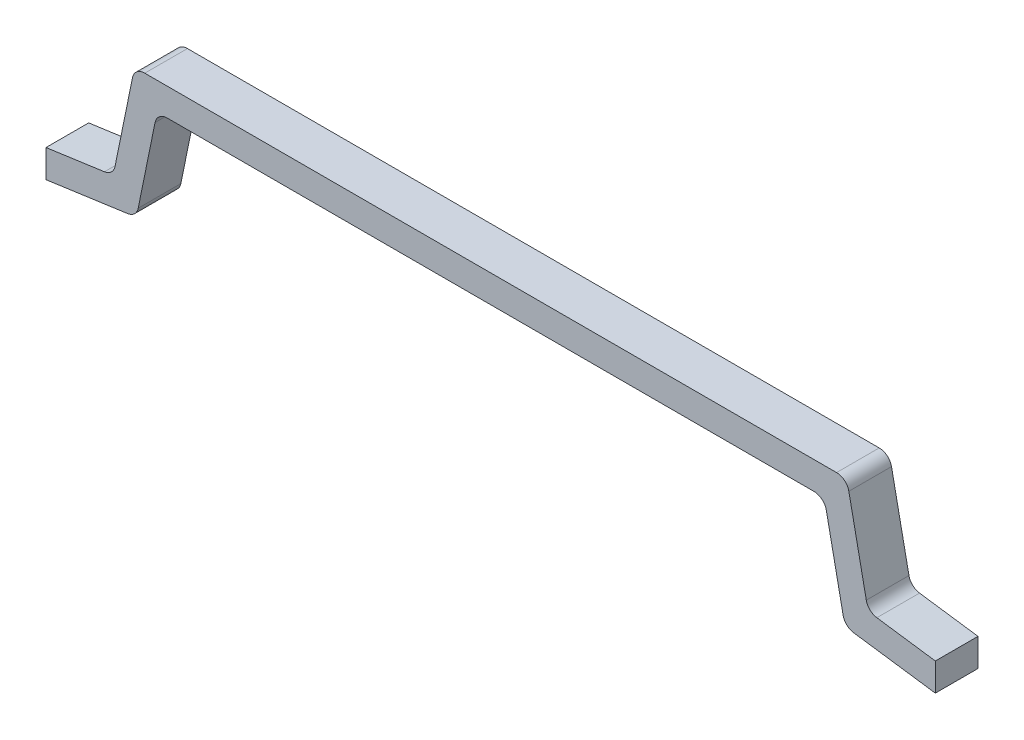
ISO-10303-21;
HEADER;
FILE_DESCRIPTION(('STEP AP214'),'2;1');
FILE_NAME('part.step','',(''),(''),'','','');
FILE_SCHEMA(('AUTOMOTIVE_DESIGN { 1 0 10303 214 1 1 1 1 }'));
ENDSEC;
DATA;
#1=APPLICATION_CONTEXT('core data for automotive mechanical design processes');
#2=APPLICATION_PROTOCOL_DEFINITION('international standard','automotive_design',2000,#1);
#3=PRODUCT_CONTEXT('',#1,'mechanical');
#4=PRODUCT('Part','Part','',(#3));
#5=PRODUCT_RELATED_PRODUCT_CATEGORY('part','',(#4));
#6=PRODUCT_DEFINITION_FORMATION('','',#4);
#7=PRODUCT_DEFINITION_CONTEXT('part definition',#1,'design');
#8=PRODUCT_DEFINITION('design','',#6,#7);
#9=PRODUCT_DEFINITION_SHAPE('','',#8);
#10=(LENGTH_UNIT() NAMED_UNIT(*) SI_UNIT(.MILLI.,.METRE.));
#11=(NAMED_UNIT(*) PLANE_ANGLE_UNIT() SI_UNIT($,.RADIAN.));
#12=(NAMED_UNIT(*) SI_UNIT($,.STERADIAN.) SOLID_ANGLE_UNIT());
#13=UNCERTAINTY_MEASURE_WITH_UNIT(LENGTH_MEASURE(1.E-05),#10,'distance_accuracy_value','');
#14=(GEOMETRIC_REPRESENTATION_CONTEXT(3) GLOBAL_UNCERTAINTY_ASSIGNED_CONTEXT((#13)) GLOBAL_UNIT_ASSIGNED_CONTEXT((#10,
#11,#12)) REPRESENTATION_CONTEXT('',''));
#15=CARTESIAN_POINT('',(0.,0.,0.));
#16=DIRECTION('',(0.,0.,1.));
#17=DIRECTION('',(1.,0.,0.));
#18=AXIS2_PLACEMENT_3D('',#15,#16,#17);
#19=CARTESIAN_POINT('',(1.01826531005711,-0.207636815585533,0.51));
#20=DIRECTION('',(-0.979836553914043,0.199800719753091,0.));
#21=DIRECTION('',(-0.199800719753091,-0.979836553914043,0.));
#22=AXIS2_PLACEMENT_3D('',#19,#20,#21);
#23=PLANE('',#22);
#24=DIRECTION('',(0.199800719753091,0.979836553914043,0.));
#25=VECTOR('',#24,1.);
#26=CARTESIAN_POINT('',(1.01826531005711,-0.207636815585533,0.));
#27=LINE('',#26,#25);
#28=CARTESIAN_POINT('',(1.10191926281016,0.202607956746275,0.));
#29=VERTEX_POINT('',#28);
#30=CARTESIAN_POINT('',(1.30325454437525,1.18997010796296,0.));
#31=VERTEX_POINT('',#30);
#32=EDGE_CURVE('E257',#29,#31,#27,.T.);
#33=ORIENTED_EDGE('',*,*,#32,.T.);
#34=DIRECTION('',(0.,0.,-1.));
#35=VECTOR('',#34,1.);
#36=CARTESIAN_POINT('',(1.30325454437525,1.18997010796296,0.51));
#37=LINE('',#36,#35);
#38=CARTESIAN_POINT('',(1.30325454437525,1.18997010796296,0.51));
#39=VERTEX_POINT('',#38);
#40=EDGE_CURVE('E318',#31,#39,#37,.F.);
#41=ORIENTED_EDGE('',*,*,#40,.T.);
#42=DIRECTION('',(0.199800719753091,0.979836553914043,0.));
#43=VECTOR('',#42,1.);
#44=CARTESIAN_POINT('',(1.01826531005711,-0.207636815585533,0.51));
#45=LINE('',#44,#43);
#46=CARTESIAN_POINT('',(1.10191926281016,0.202607956746275,0.51));
#47=VERTEX_POINT('',#46);
#48=EDGE_CURVE('E258',#47,#39,#45,.T.);
#49=ORIENTED_EDGE('',*,*,#48,.F.);
#50=DIRECTION('',(0.,0.,-1.));
#51=VECTOR('',#50,1.);
#52=CARTESIAN_POINT('',(1.10191926281016,0.202607956746275,0.));
#53=LINE('',#52,#51);
#54=EDGE_CURVE('E315',#47,#29,#53,.T.);
#55=ORIENTED_EDGE('',*,*,#54,.T.);
#56=EDGE_LOOP('',(#33,#41,#49,#55));
#57=FACE_BOUND('',#56,.T.);
#58=ADVANCED_FACE('F35',(#57),#23,.F.);
#59=CARTESIAN_POINT('',(0.,1.31,0.51));
#60=DIRECTION('',(0.,1.,0.));
#61=DIRECTION('',(-1.,0.,0.));
#62=AXIS2_PLACEMENT_3D('',#59,#60,#61);
#63=PLANE('',#62);
#64=DIRECTION('',(1.,0.,0.));
#65=VECTOR('',#64,1.);
#66=CARTESIAN_POINT('',(0.,1.31,0.51));
#67=LINE('',#66,#65);
#68=CARTESIAN_POINT('',(1.45023002746236,1.31,0.51));
#69=VERTEX_POINT('',#68);
#70=CARTESIAN_POINT('',(9.17976997253764,1.31,0.51));
#71=VERTEX_POINT('',#70);
#72=EDGE_CURVE('E261',#69,#71,#67,.T.);
#73=ORIENTED_EDGE('',*,*,#72,.F.);
#74=DIRECTION('',(0.,0.,-1.));
#75=VECTOR('',#74,1.);
#76=CARTESIAN_POINT('',(1.45023002746236,1.31,0.));
#77=LINE('',#76,#75);
#78=CARTESIAN_POINT('',(1.45023002746236,1.31,0.));
#79=VERTEX_POINT('',#78);
#80=EDGE_CURVE('E312',#69,#79,#77,.T.);
#81=ORIENTED_EDGE('',*,*,#80,.T.);
#82=DIRECTION('',(1.,0.,0.));
#83=VECTOR('',#82,1.);
#84=CARTESIAN_POINT('',(0.,1.31,0.));
#85=LINE('',#84,#83);
#86=CARTESIAN_POINT('',(9.17976997253764,1.31,0.));
#87=VERTEX_POINT('',#86);
#88=EDGE_CURVE('E279',#79,#87,#85,.T.);
#89=ORIENTED_EDGE('',*,*,#88,.T.);
#90=DIRECTION('',(0.,0.,-1.));
#91=VECTOR('',#90,1.);
#92=CARTESIAN_POINT('',(9.17976997253764,1.31,0.));
#93=LINE('',#92,#91);
#94=EDGE_CURVE('E235',#71,#87,#93,.T.);
#95=ORIENTED_EDGE('',*,*,#94,.F.);
#96=EDGE_LOOP('',(#73,#81,#89,#95));
#97=FACE_BOUND('',#96,.T.);
#98=ADVANCED_FACE('F361',(#97),#63,.F.);
#99=CARTESIAN_POINT('',(0.,1.64,0.51));
#100=DIRECTION('',(0.,1.,0.));
#101=DIRECTION('',(0.,0.,1.));
#102=AXIS2_PLACEMENT_3D('',#99,#100,#101);
#103=PLANE('',#102);
#104=DIRECTION('',(1.,0.,0.));
#105=VECTOR('',#104,1.);
#106=CARTESIAN_POINT('',(0.,1.64,0.));
#107=LINE('',#106,#105);
#108=CARTESIAN_POINT('',(1.18073022014588,1.64,0.));
#109=VERTEX_POINT('',#108);
#110=CARTESIAN_POINT('',(9.44926977985412,1.64,0.));
#111=VERTEX_POINT('',#110);
#112=EDGE_CURVE('E281',#109,#111,#107,.T.);
#113=ORIENTED_EDGE('',*,*,#112,.F.);
#114=DIRECTION('',(0.,0.,-1.));
#115=VECTOR('',#114,1.);
#116=CARTESIAN_POINT('',(1.18073022014588,1.64,0.51));
#117=LINE('',#116,#115);
#118=CARTESIAN_POINT('',(1.18073022014588,1.64,0.51));
#119=VERTEX_POINT('',#118);
#120=EDGE_CURVE('E306',#109,#119,#117,.F.);
#121=ORIENTED_EDGE('',*,*,#120,.T.);
#122=DIRECTION('',(1.,0.,0.));
#123=VECTOR('',#122,1.);
#124=CARTESIAN_POINT('',(0.,1.64,0.51));
#125=LINE('',#124,#123);
#126=CARTESIAN_POINT('',(9.44926977985412,1.64,0.51));
#127=VERTEX_POINT('',#126);
#128=EDGE_CURVE('E264',#119,#127,#125,.T.);
#129=ORIENTED_EDGE('',*,*,#128,.T.);
#130=DIRECTION('',(0.,0.,-1.));
#131=VECTOR('',#130,1.);
#132=CARTESIAN_POINT('',(9.44926977985412,1.64,0.51));
#133=LINE('',#132,#131);
#134=EDGE_CURVE('E228',#111,#127,#133,.F.);
#135=ORIENTED_EDGE('',*,*,#134,.F.);
#136=EDGE_LOOP('',(#113,#121,#129,#135));
#137=FACE_BOUND('',#136,.T.);
#138=ADVANCED_FACE('F393',(#137),#103,.T.);
#139=CARTESIAN_POINT('',(0.694919247265474,-0.141702578067013,0.51));
#140=DIRECTION('',(-0.979836553914043,0.199800719753091,0.));
#141=DIRECTION('',(-0.199800719753091,-0.979836553914043,0.));
#142=AXIS2_PLACEMENT_3D('',#139,#140,#141);
#143=PLANE('',#142);
#144=DIRECTION('',(0.199800719753091,0.979836553914043,0.));
#145=VECTOR('',#144,1.);
#146=CARTESIAN_POINT('',(0.694919247265474,-0.141702578067013,0.51));
#147=LINE('',#146,#145);
#148=CARTESIAN_POINT('',(0.82514908228355,0.496953543485479,0.51));
#149=VERTEX_POINT('',#148);
#150=CARTESIAN_POINT('',(1.03375473705877,1.51997010796296,0.51));
#151=VERTEX_POINT('',#150);
#152=EDGE_CURVE('E266',#149,#151,#147,.T.);
#153=ORIENTED_EDGE('',*,*,#152,.T.);
#154=DIRECTION('',(0.,0.,-1.));
#155=VECTOR('',#154,1.);
#156=CARTESIAN_POINT('',(1.03375473705877,1.51997010796296,0.51));
#157=LINE('',#156,#155);
#158=CARTESIAN_POINT('',(1.03375473705877,1.51997010796296,0.));
#159=VERTEX_POINT('',#158);
#160=EDGE_CURVE('E299',#151,#159,#157,.T.);
#161=ORIENTED_EDGE('',*,*,#160,.T.);
#162=DIRECTION('',(0.199800719753091,0.979836553914043,0.));
#163=VECTOR('',#162,1.);
#164=CARTESIAN_POINT('',(0.694919247265474,-0.141702578067013,0.));
#165=LINE('',#164,#163);
#166=CARTESIAN_POINT('',(0.82514908228355,0.496953543485479,0.));
#167=VERTEX_POINT('',#166);
#168=EDGE_CURVE('E283',#167,#159,#165,.T.);
#169=ORIENTED_EDGE('',*,*,#168,.F.);
#170=DIRECTION('',(0.,0.,-1.));
#171=VECTOR('',#170,1.);
#172=CARTESIAN_POINT('',(0.82514908228355,0.496953543485479,0.51));
#173=LINE('',#172,#171);
#174=EDGE_CURVE('E297',#167,#149,#173,.F.);
#175=ORIENTED_EDGE('',*,*,#174,.T.);
#176=EDGE_LOOP('',(#153,#161,#169,#175));
#177=FACE_BOUND('',#176,.T.);
#178=ADVANCED_FACE('F335',(#177),#143,.T.);
#179=CARTESIAN_POINT('',(-0.0386083083111942,0.27471238798996,0.51));
#180=DIRECTION('',(0.139173100960059,-0.990268068741571,0.));
#181=DIRECTION('',(0.990268068741571,0.139173100960059,0.));
#182=AXIS2_PLACEMENT_3D('',#179,#180,#181);
#183=PLANE('',#182);
#184=DIRECTION('',(-0.990268068741571,-0.139173100960059,0.));
#185=VECTOR('',#184,1.);
#186=CARTESIAN_POINT('',(-0.0386083083111942,0.27471238798996,0.51));
#187=LINE('',#186,#185);
#188=CARTESIAN_POINT('',(0.699049564340453,0.378383441137207,0.51));
#189=VERTEX_POINT('',#188);
#190=CARTESIAN_POINT('',(0.,0.280138431866462,0.51));
#191=VERTEX_POINT('',#190);
#192=EDGE_CURVE('E269',#189,#191,#187,.T.);
#193=ORIENTED_EDGE('',*,*,#192,.F.);
#194=DIRECTION('',(0.,0.,-1.));
#195=VECTOR('',#194,1.);
#196=CARTESIAN_POINT('',(0.699049564340453,0.378383441137207,0.51));
#197=LINE('',#196,#195);
#198=CARTESIAN_POINT('',(0.699049564340453,0.378383441137207,0.));
#199=VERTEX_POINT('',#198);
#200=EDGE_CURVE('E321',#189,#199,#197,.T.);
#201=ORIENTED_EDGE('',*,*,#200,.T.);
#202=DIRECTION('',(-0.990268068741571,-0.139173100960059,0.));
#203=VECTOR('',#202,1.);
#204=CARTESIAN_POINT('',(-0.0386083083111942,0.27471238798996,0.));
#205=LINE('',#204,#203);
#206=CARTESIAN_POINT('',(0.,0.280138431866462,0.));
#207=VERTEX_POINT('',#206);
#208=EDGE_CURVE('E286',#199,#207,#205,.T.);
#209=ORIENTED_EDGE('',*,*,#208,.T.);
#210=DIRECTION('',(0.,0.,-1.));
#211=VECTOR('',#210,1.);
#212=CARTESIAN_POINT('',(0.,0.280138431866462,0.51));
#213=LINE('',#212,#211);
#214=EDGE_CURVE('E294',#191,#207,#213,.T.);
#215=ORIENTED_EDGE('',*,*,#214,.F.);
#216=EDGE_LOOP('',(#193,#201,#209,#215));
#217=FACE_BOUND('',#216,.T.);
#218=ADVANCED_FACE('F338',(#217),#183,.F.);
#219=CARTESIAN_POINT('',(0.,0.,0.51));
#220=DIRECTION('',(-1.,0.,0.));
#221=DIRECTION('',(0.,-1.,0.));
#222=AXIS2_PLACEMENT_3D('',#219,#220,#221);
#223=PLANE('',#222);
#224=DIRECTION('',(0.,1.,0.));
#225=VECTOR('',#224,1.);
#226=CARTESIAN_POINT('',(0.,0.,0.));
#227=LINE('',#226,#225);
#228=CARTESIAN_POINT('',(0.,-0.0531046670646818,0.));
#229=VERTEX_POINT('',#228);
#230=EDGE_CURVE('E288',#229,#207,#227,.T.);
#231=ORIENTED_EDGE('',*,*,#230,.F.);
#232=DIRECTION('',(0.,0.,-1.));
#233=VECTOR('',#232,1.);
#234=CARTESIAN_POINT('',(0.,-0.0531046670646818,0.51));
#235=LINE('',#234,#233);
#236=CARTESIAN_POINT('',(0.,-0.0531046670646818,0.51));
#237=VERTEX_POINT('',#236);
#238=EDGE_CURVE('E276',#237,#229,#235,.T.);
#239=ORIENTED_EDGE('',*,*,#238,.F.);
#240=DIRECTION('',(0.,1.,0.));
#241=VECTOR('',#240,1.);
#242=CARTESIAN_POINT('',(0.,0.,0.51));
#243=LINE('',#242,#241);
#244=EDGE_CURVE('E271',#237,#191,#243,.T.);
#245=ORIENTED_EDGE('',*,*,#244,.T.);
#246=ORIENTED_EDGE('',*,*,#214,.T.);
#247=EDGE_LOOP('',(#231,#239,#245,#246));
#248=FACE_BOUND('',#247,.T.);
#249=ADVANCED_FACE('F345',(#248),#223,.T.);
#250=CARTESIAN_POINT('',(0.00731881500562515,-0.0520760746947589,0.51));
#251=DIRECTION('',(0.139173100960059,-0.990268068741571,0.));
#252=DIRECTION('',(0.990268068741571,0.139173100960059,0.));
#253=AXIS2_PLACEMENT_3D('',#250,#251,#252);
#254=PLANE('',#253);
#255=DIRECTION('',(-0.990268068741571,-0.139173100960059,0.));
#256=VECTOR('',#255,1.);
#257=CARTESIAN_POINT('',(0.00731881500562515,-0.0520760746947589,0.));
#258=LINE('',#257,#256);
#259=CARTESIAN_POINT('',(0.975819744867063,0.0840378543980031,0.));
#260=VERTEX_POINT('',#259);
#261=EDGE_CURVE('E262',#260,#229,#258,.T.);
#262=ORIENTED_EDGE('',*,*,#261,.F.);
#263=DIRECTION('',(0.,0.,-1.));
#264=VECTOR('',#263,1.);
#265=CARTESIAN_POINT('',(0.975819744867063,0.084037854398003,0.51));
#266=LINE('',#265,#264);
#267=CARTESIAN_POINT('',(0.975819744867063,0.0840378543980031,0.51));
#268=VERTEX_POINT('',#267);
#269=EDGE_CURVE('E50',#260,#268,#266,.F.);
#270=ORIENTED_EDGE('',*,*,#269,.T.);
#271=DIRECTION('',(-0.990268068741571,-0.139173100960059,0.));
#272=VECTOR('',#271,1.);
#273=CARTESIAN_POINT('',(0.00731881500562515,-0.0520760746947589,0.51));
#274=LINE('',#273,#272);
#275=EDGE_CURVE('E274',#268,#237,#274,.T.);
#276=ORIENTED_EDGE('',*,*,#275,.T.);
#277=ORIENTED_EDGE('',*,*,#238,.T.);
#278=EDGE_LOOP('',(#262,#270,#276,#277));
#279=FACE_BOUND('',#278,.T.);
#280=ADVANCED_FACE('F346',(#279),#254,.T.);
#281=CARTESIAN_POINT('',(0.,0.,0.51));
#282=DIRECTION('',(0.,0.,1.));
#283=DIRECTION('',(1.,0.,0.));
#284=AXIS2_PLACEMENT_3D('',#281,#282,#283);
#285=PLANE('',#284);
#286=ORIENTED_EDGE('',*,*,#128,.F.);
#287=CARTESIAN_POINT('',(1.18073022014588,1.49,0.51));
#288=DIRECTION('',(0.,0.,1.));
#289=DIRECTION('',(1.,0.,0.));
#290=AXIS2_PLACEMENT_3D('',#287,#288,#289);
#291=CIRCLE('',#290,0.15);
#292=EDGE_CURVE('E310',#119,#151,#291,.T.);
#293=ORIENTED_EDGE('',*,*,#292,.T.);
#294=ORIENTED_EDGE('',*,*,#152,.F.);
#295=CARTESIAN_POINT('',(0.678173599196444,0.526923651448443,0.51));
#296=DIRECTION('',(0.,0.,1.));
#297=DIRECTION('',(1.,0.,0.));
#298=AXIS2_PLACEMENT_3D('',#295,#296,#297);
#299=CIRCLE('',#298,0.15);
#300=EDGE_CURVE('E11',#149,#189,#299,.F.);
#301=ORIENTED_EDGE('',*,*,#300,.T.);
#302=ORIENTED_EDGE('',*,*,#192,.T.);
#303=ORIENTED_EDGE('',*,*,#244,.F.);
#304=ORIENTED_EDGE('',*,*,#275,.F.);
#305=CARTESIAN_POINT('',(0.954943779723054,0.232578064709239,0.51));
#306=DIRECTION('',(0.,0.,1.));
#307=DIRECTION('',(1.,0.,0.));
#308=AXIS2_PLACEMENT_3D('',#305,#306,#307);
#309=CIRCLE('',#308,0.15);
#310=EDGE_CURVE('E308',#268,#47,#309,.T.);
#311=ORIENTED_EDGE('',*,*,#310,.T.);
#312=ORIENTED_EDGE('',*,*,#48,.T.);
#313=CARTESIAN_POINT('',(1.45023002746236,1.16,0.51));
#314=DIRECTION('',(0.,0.,1.));
#315=DIRECTION('',(1.,0.,0.));
#316=AXIS2_PLACEMENT_3D('',#313,#314,#315);
#317=CIRCLE('',#316,0.15);
#318=EDGE_CURVE('E326',#39,#69,#317,.F.);
#319=ORIENTED_EDGE('',*,*,#318,.T.);
#320=ORIENTED_EDGE('',*,*,#72,.T.);
#321=CARTESIAN_POINT('',(9.17976997253764,1.16,0.51));
#322=DIRECTION('',(0.,0.,-1.));
#323=DIRECTION('',(-1.,0.,0.));
#324=AXIS2_PLACEMENT_3D('',#321,#322,#323);
#325=CIRCLE('',#324,0.15);
#326=CARTESIAN_POINT('',(9.32674545562475,1.18997010796296,0.51));
#327=VERTEX_POINT('',#326);
#328=EDGE_CURVE('E250',#327,#71,#325,.F.);
#329=ORIENTED_EDGE('',*,*,#328,.F.);
#330=DIRECTION('',(-0.199800719753091,0.979836553914043,0.));
#331=VECTOR('',#330,1.);
#332=CARTESIAN_POINT('',(9.61173468994289,-0.207636815585533,0.51));
#333=LINE('',#332,#331);
#334=CARTESIAN_POINT('',(9.52808073718984,0.202607956746275,0.51));
#335=VERTEX_POINT('',#334);
#336=EDGE_CURVE('E201',#335,#327,#333,.T.);
#337=ORIENTED_EDGE('',*,*,#336,.F.);
#338=CARTESIAN_POINT('',(9.67505622027694,0.232578064709239,0.51));
#339=DIRECTION('',(0.,0.,-1.));
#340=DIRECTION('',(-1.,0.,0.));
#341=AXIS2_PLACEMENT_3D('',#338,#339,#340);
#342=CIRCLE('',#341,0.15);
#343=CARTESIAN_POINT('',(9.65418025513294,0.0840378543980031,0.51));
#344=VERTEX_POINT('',#343);
#345=EDGE_CURVE('E231',#344,#335,#342,.T.);
#346=ORIENTED_EDGE('',*,*,#345,.F.);
#347=DIRECTION('',(0.990268068741571,-0.139173100960059,0.));
#348=VECTOR('',#347,1.);
#349=CARTESIAN_POINT('',(10.6226811849944,-0.0520760746947589,0.51));
#350=LINE('',#349,#348);
#351=CARTESIAN_POINT('',(10.63,-0.0531046670646818,0.51));
#352=VERTEX_POINT('',#351);
#353=EDGE_CURVE('E178',#344,#352,#350,.T.);
#354=ORIENTED_EDGE('',*,*,#353,.T.);
#355=DIRECTION('',(0.,1.,0.));
#356=VECTOR('',#355,1.);
#357=CARTESIAN_POINT('',(10.63,0.,0.51));
#358=LINE('',#357,#356);
#359=CARTESIAN_POINT('',(10.63,0.280138431866462,0.51));
#360=VERTEX_POINT('',#359);
#361=EDGE_CURVE('E171',#352,#360,#358,.T.);
#362=ORIENTED_EDGE('',*,*,#361,.T.);
#363=DIRECTION('',(0.990268068741571,-0.139173100960059,0.));
#364=VECTOR('',#363,1.);
#365=CARTESIAN_POINT('',(10.6686083083112,0.27471238798996,0.51));
#366=LINE('',#365,#364);
#367=CARTESIAN_POINT('',(9.93095043565955,0.378383441137207,0.51));
#368=VERTEX_POINT('',#367);
#369=EDGE_CURVE('E176',#368,#360,#366,.T.);
#370=ORIENTED_EDGE('',*,*,#369,.F.);
#371=CARTESIAN_POINT('',(9.95182640080356,0.526923651448443,0.51));
#372=DIRECTION('',(0.,0.,-1.));
#373=DIRECTION('',(-1.,0.,0.));
#374=AXIS2_PLACEMENT_3D('',#371,#372,#373);
#375=CIRCLE('',#374,0.15);
#376=CARTESIAN_POINT('',(9.80485091771645,0.496953543485479,0.51));
#377=VERTEX_POINT('',#376);
#378=EDGE_CURVE('E255',#377,#368,#375,.F.);
#379=ORIENTED_EDGE('',*,*,#378,.F.);
#380=DIRECTION('',(-0.199800719753091,0.979836553914043,0.));
#381=VECTOR('',#380,1.);
#382=CARTESIAN_POINT('',(9.93508075273452,-0.141702578067013,0.51));
#383=LINE('',#382,#381);
#384=CARTESIAN_POINT('',(9.59624526294123,1.51997010796296,0.51));
#385=VERTEX_POINT('',#384);
#386=EDGE_CURVE('E198',#377,#385,#383,.T.);
#387=ORIENTED_EDGE('',*,*,#386,.T.);
#388=CARTESIAN_POINT('',(9.44926977985412,1.49,0.51));
#389=DIRECTION('',(0.,0.,-1.));
#390=DIRECTION('',(-1.,0.,0.));
#391=AXIS2_PLACEMENT_3D('',#388,#389,#390);
#392=CIRCLE('',#391,0.15);
#393=EDGE_CURVE('E233',#127,#385,#392,.T.);
#394=ORIENTED_EDGE('',*,*,#393,.F.);
#395=EDGE_LOOP('',(#286,#293,#294,#301,#302,#303,#304,#311,#312,#319,#320,#329,#337,#346,#354,
#362,#370,#379,#387,#394));
#396=FACE_BOUND('',#395,.T.);
#397=ADVANCED_FACE('F174',(#396),#285,.T.);
#398=CARTESIAN_POINT('',(0.,0.,0.));
#399=DIRECTION('',(0.,0.,1.));
#400=DIRECTION('',(1.,0.,0.));
#401=AXIS2_PLACEMENT_3D('',#398,#399,#400);
#402=PLANE('',#401);
#403=ORIENTED_EDGE('',*,*,#168,.T.);
#404=CARTESIAN_POINT('',(1.18073022014588,1.49,0.));
#405=DIRECTION('',(0.,0.,1.));
#406=DIRECTION('',(1.,0.,0.));
#407=AXIS2_PLACEMENT_3D('',#404,#405,#406);
#408=CIRCLE('',#407,0.15);
#409=EDGE_CURVE('E304',#159,#109,#408,.F.);
#410=ORIENTED_EDGE('',*,*,#409,.T.);
#411=ORIENTED_EDGE('',*,*,#112,.T.);
#412=CARTESIAN_POINT('',(9.44926977985412,1.49,0.));
#413=DIRECTION('',(0.,0.,-1.));
#414=DIRECTION('',(-1.,0.,0.));
#415=AXIS2_PLACEMENT_3D('',#412,#413,#414);
#416=CIRCLE('',#415,0.15);
#417=CARTESIAN_POINT('',(9.59624526294123,1.51997010796296,0.));
#418=VERTEX_POINT('',#417);
#419=EDGE_CURVE('E225',#418,#111,#416,.F.);
#420=ORIENTED_EDGE('',*,*,#419,.F.);
#421=DIRECTION('',(-0.199800719753091,0.979836553914043,0.));
#422=VECTOR('',#421,1.);
#423=CARTESIAN_POINT('',(9.93508075273452,-0.141702578067013,0.));
#424=LINE('',#423,#422);
#425=CARTESIAN_POINT('',(9.80485091771645,0.496953543485479,0.));
#426=VERTEX_POINT('',#425);
#427=EDGE_CURVE('E209',#426,#418,#424,.T.);
#428=ORIENTED_EDGE('',*,*,#427,.F.);
#429=CARTESIAN_POINT('',(9.95182640080356,0.526923651448443,0.));
#430=DIRECTION('',(0.,0.,-1.));
#431=DIRECTION('',(-1.,0.,0.));
#432=AXIS2_PLACEMENT_3D('',#429,#430,#431);
#433=CIRCLE('',#432,0.15);
#434=CARTESIAN_POINT('',(9.93095043565955,0.378383441137207,0.));
#435=VERTEX_POINT('',#434);
#436=EDGE_CURVE('E253',#435,#426,#433,.T.);
#437=ORIENTED_EDGE('',*,*,#436,.F.);
#438=DIRECTION('',(0.990268068741571,-0.139173100960059,0.));
#439=VECTOR('',#438,1.);
#440=CARTESIAN_POINT('',(10.6686083083112,0.27471238798996,0.));
#441=LINE('',#440,#439);
#442=CARTESIAN_POINT('',(10.63,0.280138431866462,0.));
#443=VERTEX_POINT('',#442);
#444=EDGE_CURVE('E212',#435,#443,#441,.T.);
#445=ORIENTED_EDGE('',*,*,#444,.T.);
#446=DIRECTION('',(0.,1.,0.));
#447=VECTOR('',#446,1.);
#448=CARTESIAN_POINT('',(10.63,0.,0.));
#449=LINE('',#448,#447);
#450=CARTESIAN_POINT('',(10.63,-0.0531046670646818,0.));
#451=VERTEX_POINT('',#450);
#452=EDGE_CURVE('E187',#451,#443,#449,.T.);
#453=ORIENTED_EDGE('',*,*,#452,.F.);
#454=DIRECTION('',(0.990268068741571,-0.139173100960059,0.));
#455=VECTOR('',#454,1.);
#456=CARTESIAN_POINT('',(10.6226811849944,-0.0520760746947589,0.));
#457=LINE('',#456,#455);
#458=CARTESIAN_POINT('',(9.65418025513294,0.0840378543980031,0.));
#459=VERTEX_POINT('',#458);
#460=EDGE_CURVE('E215',#459,#451,#457,.T.);
#461=ORIENTED_EDGE('',*,*,#460,.F.);
#462=CARTESIAN_POINT('',(9.67505622027694,0.232578064709239,0.));
#463=DIRECTION('',(0.,0.,-1.));
#464=DIRECTION('',(-1.,0.,0.));
#465=AXIS2_PLACEMENT_3D('',#462,#463,#464);
#466=CIRCLE('',#465,0.15);
#467=CARTESIAN_POINT('',(9.52808073718984,0.202607956746275,0.));
#468=VERTEX_POINT('',#467);
#469=EDGE_CURVE('E223',#468,#459,#466,.F.);
#470=ORIENTED_EDGE('',*,*,#469,.F.);
#471=DIRECTION('',(-0.199800719753091,0.979836553914043,0.));
#472=VECTOR('',#471,1.);
#473=CARTESIAN_POINT('',(9.61173468994289,-0.207636815585533,0.));
#474=LINE('',#473,#472);
#475=CARTESIAN_POINT('',(9.32674545562475,1.18997010796296,0.));
#476=VERTEX_POINT('',#475);
#477=EDGE_CURVE('E206',#468,#476,#474,.T.);
#478=ORIENTED_EDGE('',*,*,#477,.T.);
#479=CARTESIAN_POINT('',(9.17976997253764,1.16,0.));
#480=DIRECTION('',(0.,0.,-1.));
#481=DIRECTION('',(-1.,0.,0.));
#482=AXIS2_PLACEMENT_3D('',#479,#480,#481);
#483=CIRCLE('',#482,0.15);
#484=EDGE_CURVE('E248',#87,#476,#483,.T.);
#485=ORIENTED_EDGE('',*,*,#484,.F.);
#486=ORIENTED_EDGE('',*,*,#88,.F.);
#487=CARTESIAN_POINT('',(1.45023002746236,1.16,0.));
#488=DIRECTION('',(0.,0.,1.));
#489=DIRECTION('',(1.,0.,0.));
#490=AXIS2_PLACEMENT_3D('',#487,#488,#489);
#491=CIRCLE('',#490,0.15);
#492=EDGE_CURVE('E324',#79,#31,#491,.T.);
#493=ORIENTED_EDGE('',*,*,#492,.T.);
#494=ORIENTED_EDGE('',*,*,#32,.F.);
#495=CARTESIAN_POINT('',(0.954943779723054,0.232578064709239,0.));
#496=DIRECTION('',(0.,0.,1.));
#497=DIRECTION('',(1.,0.,0.));
#498=AXIS2_PLACEMENT_3D('',#495,#496,#497);
#499=CIRCLE('',#498,0.15);
#500=EDGE_CURVE('E302',#29,#260,#499,.F.);
#501=ORIENTED_EDGE('',*,*,#500,.T.);
#502=ORIENTED_EDGE('',*,*,#261,.T.);
#503=ORIENTED_EDGE('',*,*,#230,.T.);
#504=ORIENTED_EDGE('',*,*,#208,.F.);
#505=CARTESIAN_POINT('',(0.678173599196444,0.526923651448443,0.));
#506=DIRECTION('',(0.,0.,1.));
#507=DIRECTION('',(1.,0.,0.));
#508=AXIS2_PLACEMENT_3D('',#505,#506,#507);
#509=CIRCLE('',#508,0.15);
#510=EDGE_CURVE('E43',#199,#167,#509,.T.);
#511=ORIENTED_EDGE('',*,*,#510,.T.);
#512=EDGE_LOOP('',(#403,#410,#411,#420,#428,#437,#445,#453,#461,#470,#478,#485,#486,#493,#494,
#501,#502,#503,#504,#511));
#513=FACE_BOUND('',#512,.T.);
#514=ADVANCED_FACE('F330',(#513),#402,.F.);
#515=CARTESIAN_POINT('',(1.18073022014588,1.49,0.51));
#516=DIRECTION('',(0.,0.,-1.));
#517=DIRECTION('',(-1.,0.,0.));
#518=AXIS2_PLACEMENT_3D('',#515,#516,#517);
#519=CYLINDRICAL_SURFACE('',#518,0.15);
#520=ORIENTED_EDGE('',*,*,#292,.F.);
#521=ORIENTED_EDGE('',*,*,#120,.F.);
#522=ORIENTED_EDGE('',*,*,#409,.F.);
#523=ORIENTED_EDGE('',*,*,#160,.F.);
#524=EDGE_LOOP('',(#520,#521,#522,#523));
#525=FACE_BOUND('',#524,.T.);
#526=ADVANCED_FACE('F397',(#525),#519,.T.);
#527=CARTESIAN_POINT('',(1.45023002746236,1.16,0.51));
#528=DIRECTION('',(0.,0.,1.));
#529=DIRECTION('',(1.,0.,0.));
#530=AXIS2_PLACEMENT_3D('',#527,#528,#529);
#531=CYLINDRICAL_SURFACE('',#530,0.15);
#532=ORIENTED_EDGE('',*,*,#318,.F.);
#533=ORIENTED_EDGE('',*,*,#40,.F.);
#534=ORIENTED_EDGE('',*,*,#492,.F.);
#535=ORIENTED_EDGE('',*,*,#80,.F.);
#536=EDGE_LOOP('',(#532,#533,#534,#535));
#537=FACE_BOUND('',#536,.T.);
#538=ADVANCED_FACE('F356',(#537),#531,.F.);
#539=CARTESIAN_POINT('',(0.954943779723054,0.232578064709239,0.51));
#540=DIRECTION('',(0.,0.,1.));
#541=DIRECTION('',(1.,0.,0.));
#542=AXIS2_PLACEMENT_3D('',#539,#540,#541);
#543=CYLINDRICAL_SURFACE('',#542,0.15);
#544=ORIENTED_EDGE('',*,*,#310,.F.);
#545=ORIENTED_EDGE('',*,*,#269,.F.);
#546=ORIENTED_EDGE('',*,*,#500,.F.);
#547=ORIENTED_EDGE('',*,*,#54,.F.);
#548=EDGE_LOOP('',(#544,#545,#546,#547));
#549=FACE_BOUND('',#548,.T.);
#550=ADVANCED_FACE('F348',(#549),#543,.T.);
#551=CARTESIAN_POINT('',(0.678173599196444,0.526923651448443,0.51));
#552=DIRECTION('',(0.,0.,-1.));
#553=DIRECTION('',(-1.,0.,0.));
#554=AXIS2_PLACEMENT_3D('',#551,#552,#553);
#555=CYLINDRICAL_SURFACE('',#554,0.15);
#556=ORIENTED_EDGE('',*,*,#300,.F.);
#557=ORIENTED_EDGE('',*,*,#174,.F.);
#558=ORIENTED_EDGE('',*,*,#510,.F.);
#559=ORIENTED_EDGE('',*,*,#200,.F.);
#560=EDGE_LOOP('',(#556,#557,#558,#559));
#561=FACE_BOUND('',#560,.T.);
#562=ADVANCED_FACE('F37',(#561),#555,.F.);
#563=CARTESIAN_POINT('',(9.61173468994289,-0.207636815585533,0.51));
#564=DIRECTION('',(0.979836553914043,0.199800719753091,0.));
#565=DIRECTION('',(0.199800719753091,-0.979836553914043,0.));
#566=AXIS2_PLACEMENT_3D('',#563,#564,#565);
#567=PLANE('',#566);
#568=ORIENTED_EDGE('',*,*,#477,.F.);
#569=DIRECTION('',(0.,0.,-1.));
#570=VECTOR('',#569,1.);
#571=CARTESIAN_POINT('',(9.52808073718984,0.202607956746275,0.));
#572=LINE('',#571,#570);
#573=EDGE_CURVE('E238',#335,#468,#572,.T.);
#574=ORIENTED_EDGE('',*,*,#573,.F.);
#575=ORIENTED_EDGE('',*,*,#336,.T.);
#576=DIRECTION('',(0.,0.,-1.));
#577=VECTOR('',#576,1.);
#578=CARTESIAN_POINT('',(9.32674545562475,1.18997010796296,0.51));
#579=LINE('',#578,#577);
#580=EDGE_CURVE('E241',#476,#327,#579,.F.);
#581=ORIENTED_EDGE('',*,*,#580,.F.);
#582=EDGE_LOOP('',(#568,#574,#575,#581));
#583=FACE_BOUND('',#582,.T.);
#584=ADVANCED_FACE('F372',(#583),#567,.F.);
#585=CARTESIAN_POINT('',(9.93508075273452,-0.141702578067013,0.51));
#586=DIRECTION('',(0.979836553914043,0.199800719753091,0.));
#587=DIRECTION('',(0.199800719753091,-0.979836553914043,0.));
#588=AXIS2_PLACEMENT_3D('',#585,#586,#587);
#589=PLANE('',#588);
#590=ORIENTED_EDGE('',*,*,#386,.F.);
#591=DIRECTION('',(0.,0.,-1.));
#592=VECTOR('',#591,1.);
#593=CARTESIAN_POINT('',(9.80485091771645,0.496953543485479,0.51));
#594=LINE('',#593,#592);
#595=EDGE_CURVE('E191',#426,#377,#594,.F.);
#596=ORIENTED_EDGE('',*,*,#595,.F.);
#597=ORIENTED_EDGE('',*,*,#427,.T.);
#598=DIRECTION('',(0.,0.,-1.));
#599=VECTOR('',#598,1.);
#600=CARTESIAN_POINT('',(9.59624526294123,1.51997010796296,0.51));
#601=LINE('',#600,#599);
#602=EDGE_CURVE('E220',#385,#418,#601,.T.);
#603=ORIENTED_EDGE('',*,*,#602,.F.);
#604=EDGE_LOOP('',(#590,#596,#597,#603));
#605=FACE_BOUND('',#604,.T.);
#606=ADVANCED_FACE('F387',(#605),#589,.T.);
#607=CARTESIAN_POINT('',(10.6686083083112,0.27471238798996,0.51));
#608=DIRECTION('',(-0.139173100960059,-0.990268068741571,0.));
#609=DIRECTION('',(-0.990268068741571,0.139173100960059,0.));
#610=AXIS2_PLACEMENT_3D('',#607,#608,#609);
#611=PLANE('',#610);
#612=ORIENTED_EDGE('',*,*,#369,.T.);
#613=DIRECTION('',(0.,0.,-1.));
#614=VECTOR('',#613,1.);
#615=CARTESIAN_POINT('',(10.63,0.280138431866462,0.51));
#616=LINE('',#615,#614);
#617=EDGE_CURVE('E184',#360,#443,#616,.T.);
#618=ORIENTED_EDGE('',*,*,#617,.T.);
#619=ORIENTED_EDGE('',*,*,#444,.F.);
#620=DIRECTION('',(0.,0.,-1.));
#621=VECTOR('',#620,1.);
#622=CARTESIAN_POINT('',(9.93095043565955,0.378383441137207,0.51));
#623=LINE('',#622,#621);
#624=EDGE_CURVE('E197',#368,#435,#623,.T.);
#625=ORIENTED_EDGE('',*,*,#624,.F.);
#626=EDGE_LOOP('',(#612,#618,#619,#625));
#627=FACE_BOUND('',#626,.T.);
#628=ADVANCED_FACE('F195',(#627),#611,.F.);
#629=CARTESIAN_POINT('',(10.63,0.,0.51));
#630=DIRECTION('',(1.,0.,0.));
#631=DIRECTION('',(0.,-1.,0.));
#632=AXIS2_PLACEMENT_3D('',#629,#630,#631);
#633=PLANE('',#632);
#634=ORIENTED_EDGE('',*,*,#452,.T.);
#635=ORIENTED_EDGE('',*,*,#617,.F.);
#636=ORIENTED_EDGE('',*,*,#361,.F.);
#637=DIRECTION('',(0.,0.,-1.));
#638=VECTOR('',#637,1.);
#639=CARTESIAN_POINT('',(10.63,-0.0531046670646818,0.51));
#640=LINE('',#639,#638);
#641=EDGE_CURVE('E192',#352,#451,#640,.T.);
#642=ORIENTED_EDGE('',*,*,#641,.T.);
#643=EDGE_LOOP('',(#634,#635,#636,#642));
#644=FACE_BOUND('',#643,.T.);
#645=ADVANCED_FACE('F185',(#644),#633,.T.);
#646=CARTESIAN_POINT('',(10.6226811849944,-0.0520760746947589,0.51));
#647=DIRECTION('',(-0.139173100960059,-0.990268068741571,0.));
#648=DIRECTION('',(-0.990268068741571,0.139173100960059,0.));
#649=AXIS2_PLACEMENT_3D('',#646,#647,#648);
#650=PLANE('',#649);
#651=ORIENTED_EDGE('',*,*,#460,.T.);
#652=ORIENTED_EDGE('',*,*,#641,.F.);
#653=ORIENTED_EDGE('',*,*,#353,.F.);
#654=DIRECTION('',(0.,0.,-1.));
#655=VECTOR('',#654,1.);
#656=CARTESIAN_POINT('',(9.65418025513294,0.084037854398003,0.51));
#657=LINE('',#656,#655);
#658=EDGE_CURVE('E244',#459,#344,#657,.F.);
#659=ORIENTED_EDGE('',*,*,#658,.F.);
#660=EDGE_LOOP('',(#651,#652,#653,#659));
#661=FACE_BOUND('',#660,.T.);
#662=ADVANCED_FACE('F378',(#661),#650,.T.);
#663=CARTESIAN_POINT('',(9.44926977985412,1.49,0.51));
#664=DIRECTION('',(0.,0.,-1.));
#665=DIRECTION('',(1.,0.,0.));
#666=AXIS2_PLACEMENT_3D('',#663,#664,#665);
#667=CYLINDRICAL_SURFACE('',#666,0.15);
#668=ORIENTED_EDGE('',*,*,#393,.T.);
#669=ORIENTED_EDGE('',*,*,#602,.T.);
#670=ORIENTED_EDGE('',*,*,#419,.T.);
#671=ORIENTED_EDGE('',*,*,#134,.T.);
#672=EDGE_LOOP('',(#668,#669,#670,#671));
#673=FACE_BOUND('',#672,.T.);
#674=ADVANCED_FACE('F389',(#673),#667,.T.);
#675=CARTESIAN_POINT('',(9.17976997253764,1.16,0.51));
#676=DIRECTION('',(0.,0.,1.));
#677=DIRECTION('',(-1.,0.,0.));
#678=AXIS2_PLACEMENT_3D('',#675,#676,#677);
#679=CYLINDRICAL_SURFACE('',#678,0.15);
#680=ORIENTED_EDGE('',*,*,#328,.T.);
#681=ORIENTED_EDGE('',*,*,#94,.T.);
#682=ORIENTED_EDGE('',*,*,#484,.T.);
#683=ORIENTED_EDGE('',*,*,#580,.T.);
#684=EDGE_LOOP('',(#680,#681,#682,#683));
#685=FACE_BOUND('',#684,.T.);
#686=ADVANCED_FACE('F365',(#685),#679,.F.);
#687=CARTESIAN_POINT('',(9.67505622027694,0.232578064709239,0.51));
#688=DIRECTION('',(0.,0.,1.));
#689=DIRECTION('',(-1.,0.,0.));
#690=AXIS2_PLACEMENT_3D('',#687,#688,#689);
#691=CYLINDRICAL_SURFACE('',#690,0.15);
#692=ORIENTED_EDGE('',*,*,#345,.T.);
#693=ORIENTED_EDGE('',*,*,#573,.T.);
#694=ORIENTED_EDGE('',*,*,#469,.T.);
#695=ORIENTED_EDGE('',*,*,#658,.T.);
#696=EDGE_LOOP('',(#692,#693,#694,#695));
#697=FACE_BOUND('',#696,.T.);
#698=ADVANCED_FACE('F374',(#697),#691,.T.);
#699=CARTESIAN_POINT('',(9.95182640080356,0.526923651448443,0.51));
#700=DIRECTION('',(0.,0.,-1.));
#701=DIRECTION('',(1.,0.,0.));
#702=AXIS2_PLACEMENT_3D('',#699,#700,#701);
#703=CYLINDRICAL_SURFACE('',#702,0.15);
#704=ORIENTED_EDGE('',*,*,#378,.T.);
#705=ORIENTED_EDGE('',*,*,#624,.T.);
#706=ORIENTED_EDGE('',*,*,#436,.T.);
#707=ORIENTED_EDGE('',*,*,#595,.T.);
#708=EDGE_LOOP('',(#704,#705,#706,#707));
#709=FACE_BOUND('',#708,.T.);
#710=ADVANCED_FACE('F382',(#709),#703,.F.);
#711=CLOSED_SHELL('',(#58,#98,#138,#178,#218,#249,#280,#397,#514,#526,#538,#550,#562,#584,#606,
#628,#645,#662,#674,#686,#698,#710));
#712=MANIFOLD_SOLID_BREP('B2',#711);
#713=ADVANCED_BREP_SHAPE_REPRESENTATION('',(#18,#712),#14);
#714=SHAPE_DEFINITION_REPRESENTATION(#9,#713);
ENDSEC;
END-ISO-10303-21;
